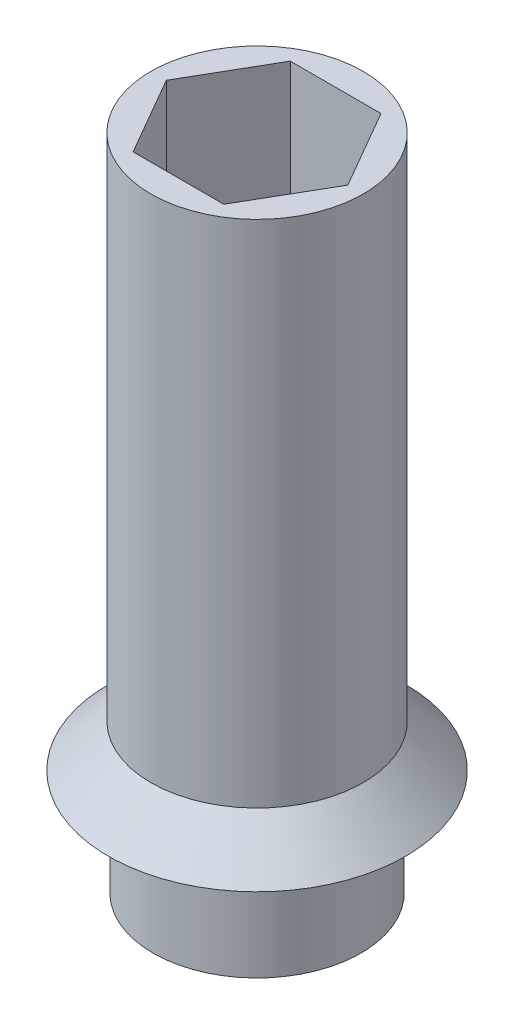
ISO-10303-21;
HEADER;
FILE_DESCRIPTION(('STEP AP214'),'2;1');
FILE_NAME('part.step','',(''),(''),'','','');
FILE_SCHEMA(('AUTOMOTIVE_DESIGN { 1 0 10303 214 1 1 1 1 }'));
ENDSEC;
DATA;
#1=APPLICATION_CONTEXT('core data for automotive mechanical design processes');
#2=APPLICATION_PROTOCOL_DEFINITION('international standard','automotive_design',2000,#1);
#3=PRODUCT_CONTEXT('',#1,'mechanical');
#4=PRODUCT('Part','Part','',(#3));
#5=PRODUCT_RELATED_PRODUCT_CATEGORY('part','',(#4));
#6=PRODUCT_DEFINITION_FORMATION('','',#4);
#7=PRODUCT_DEFINITION_CONTEXT('part definition',#1,'design');
#8=PRODUCT_DEFINITION('design','',#6,#7);
#9=PRODUCT_DEFINITION_SHAPE('','',#8);
#10=(LENGTH_UNIT() NAMED_UNIT(*) SI_UNIT(.MILLI.,.METRE.));
#11=(NAMED_UNIT(*) PLANE_ANGLE_UNIT() SI_UNIT($,.RADIAN.));
#12=(NAMED_UNIT(*) SI_UNIT($,.STERADIAN.) SOLID_ANGLE_UNIT());
#13=UNCERTAINTY_MEASURE_WITH_UNIT(LENGTH_MEASURE(1.E-05),#10,'distance_accuracy_value','');
#14=(GEOMETRIC_REPRESENTATION_CONTEXT(3) GLOBAL_UNCERTAINTY_ASSIGNED_CONTEXT((#13)) GLOBAL_UNIT_ASSIGNED_CONTEXT((#10,
#11,#12)) REPRESENTATION_CONTEXT('',''));
#15=CARTESIAN_POINT('',(0.,0.,0.));
#16=DIRECTION('',(0.,0.,1.));
#17=DIRECTION('',(1.,0.,0.));
#18=AXIS2_PLACEMENT_3D('',#15,#16,#17);
#19=CARTESIAN_POINT('',(0.,31.,0.));
#20=DIRECTION('',(0.,-1.,0.));
#21=DIRECTION('',(0.,0.,-1.));
#22=AXIS2_PLACEMENT_3D('',#19,#20,#21);
#23=CYLINDRICAL_SURFACE('',#22,5.);
#24=CARTESIAN_POINT('',(0.,31.,0.));
#25=DIRECTION('',(0.,1.,0.));
#26=DIRECTION('',(0.,0.,1.));
#27=AXIS2_PLACEMENT_3D('',#24,#25,#26);
#28=CIRCLE('',#27,5.);
#29=CARTESIAN_POINT('',(0.,31.,-5.));
#30=VERTEX_POINT('',#29);
#31=EDGE_CURVE('E124',#30,#30,#28,.T.);
#32=CARTESIAN_POINT('',(0.,7.,0.));
#33=DIRECTION('',(0.,-1.,0.));
#34=DIRECTION('',(0.,0.,-1.));
#35=AXIS2_PLACEMENT_3D('',#32,#33,#34);
#36=CIRCLE('',#35,5.);
#37=CARTESIAN_POINT('',(0.,7.,-5.));
#38=VERTEX_POINT('',#37);
#39=EDGE_CURVE('E11',#38,#38,#36,.T.);
#40=CARTESIAN_POINT('',(0.,31.,-5.));
#41=CARTESIAN_POINT('',(0.,30.75,-5.));
#42=CARTESIAN_POINT('',(0.,30.5,-5.));
#43=CARTESIAN_POINT('',(0.,30.,-5.));
#44=CARTESIAN_POINT('',(0.,29.75,-5.));
#45=CARTESIAN_POINT('',(0.,29.25,-5.));
#46=CARTESIAN_POINT('',(0.,29.,-5.));
#47=CARTESIAN_POINT('',(0.,28.5,-5.));
#48=CARTESIAN_POINT('',(0.,28.25,-5.));
#49=CARTESIAN_POINT('',(0.,27.75,-5.));
#50=CARTESIAN_POINT('',(0.,27.5,-5.));
#51=CARTESIAN_POINT('',(0.,27.,-5.));
#52=CARTESIAN_POINT('',(0.,26.75,-5.));
#53=CARTESIAN_POINT('',(0.,26.25,-5.));
#54=CARTESIAN_POINT('',(0.,26.,-5.));
#55=CARTESIAN_POINT('',(0.,25.5,-5.));
#56=CARTESIAN_POINT('',(0.,25.25,-5.));
#57=CARTESIAN_POINT('',(0.,24.75,-5.));
#58=CARTESIAN_POINT('',(0.,24.5,-5.));
#59=CARTESIAN_POINT('',(0.,24.,-5.));
#60=CARTESIAN_POINT('',(0.,23.75,-5.));
#61=CARTESIAN_POINT('',(0.,23.25,-5.));
#62=CARTESIAN_POINT('',(0.,23.,-5.));
#63=CARTESIAN_POINT('',(0.,22.5,-5.));
#64=CARTESIAN_POINT('',(0.,22.25,-5.));
#65=CARTESIAN_POINT('',(0.,21.75,-5.));
#66=CARTESIAN_POINT('',(0.,21.5,-5.));
#67=CARTESIAN_POINT('',(0.,21.,-5.));
#68=CARTESIAN_POINT('',(0.,20.75,-5.));
#69=CARTESIAN_POINT('',(0.,20.25,-5.));
#70=CARTESIAN_POINT('',(0.,20.,-5.));
#71=CARTESIAN_POINT('',(0.,19.5,-5.));
#72=CARTESIAN_POINT('',(0.,19.25,-5.));
#73=CARTESIAN_POINT('',(0.,18.75,-5.));
#74=CARTESIAN_POINT('',(0.,18.5,-5.));
#75=CARTESIAN_POINT('',(0.,18.,-5.));
#76=CARTESIAN_POINT('',(0.,17.75,-5.));
#77=CARTESIAN_POINT('',(0.,17.25,-5.));
#78=CARTESIAN_POINT('',(0.,17.,-5.));
#79=CARTESIAN_POINT('',(0.,16.5,-5.));
#80=CARTESIAN_POINT('',(0.,16.25,-5.));
#81=CARTESIAN_POINT('',(0.,15.75,-5.));
#82=CARTESIAN_POINT('',(0.,15.5,-5.));
#83=CARTESIAN_POINT('',(0.,15.,-5.));
#84=CARTESIAN_POINT('',(0.,14.75,-5.));
#85=CARTESIAN_POINT('',(0.,14.25,-5.));
#86=CARTESIAN_POINT('',(0.,14.,-5.));
#87=CARTESIAN_POINT('',(0.,13.5,-5.));
#88=CARTESIAN_POINT('',(0.,13.25,-5.));
#89=CARTESIAN_POINT('',(0.,12.75,-5.));
#90=CARTESIAN_POINT('',(0.,12.5,-5.));
#91=CARTESIAN_POINT('',(0.,12.,-5.));
#92=CARTESIAN_POINT('',(0.,11.75,-5.));
#93=CARTESIAN_POINT('',(0.,11.25,-5.));
#94=CARTESIAN_POINT('',(0.,11.,-5.));
#95=CARTESIAN_POINT('',(0.,10.5,-5.));
#96=CARTESIAN_POINT('',(0.,10.25,-5.));
#97=CARTESIAN_POINT('',(0.,9.75,-5.));
#98=CARTESIAN_POINT('',(0.,9.5,-5.));
#99=CARTESIAN_POINT('',(0.,9.,-5.));
#100=CARTESIAN_POINT('',(0.,8.75,-5.));
#101=CARTESIAN_POINT('',(0.,8.25,-5.));
#102=CARTESIAN_POINT('',(0.,8.,-5.));
#103=CARTESIAN_POINT('',(0.,7.5,-5.));
#104=CARTESIAN_POINT('',(0.,7.25,-5.));
#105=CARTESIAN_POINT('',(0.,7.,-5.));
#106=B_SPLINE_CURVE_WITH_KNOTS('',3,(#40,#41,#42,#43,#44,#45,#46,#47,#48,#49,#50,#51,#52,#53,
#54,#55,#56,#57,#58,#59,#60,#61,#62,#63,#64,#65,#66,#67,#68,#69,#70,#71,#72,#73,#74,#75,#76,#77,
#78,#79,#80,#81,#82,#83,#84,#85,#86,#87,#88,#89,#90,#91,#92,#93,#94,#95,#96,#97,#98,#99,#100,
#101,#102,#103,#104,#105),.UNSPECIFIED.,.F.,.F.,(4,2,2,2,2,2,2,2,2,2,2,2,2,2,2,2,2,2,2,2,2,2,2,
2,2,2,2,2,2,2,2,2,4),(0.,0.749999999999997,1.5,2.25,3.,3.75,4.5,5.25,5.99999999999999,6.75,7.5,
8.25,9.,9.74999999999999,10.5,11.25,12.,12.75,13.5,14.25,15.,15.75,16.5,17.25,18.,18.75,19.5,
20.25,21.,21.75,22.5,23.25,24.),.UNSPECIFIED.);
#107=EDGE_CURVE('BSEAM35',#30,#38,#106,.T.);
#108=ORIENTED_EDGE('',*,*,#31,.F.);
#109=ORIENTED_EDGE('',*,*,#39,.F.);
#110=ORIENTED_EDGE('',*,*,#107,.T.);
#111=ORIENTED_EDGE('',*,*,#107,.F.);
#112=EDGE_LOOP('',(#108,#110,#109,#111));
#113=FACE_BOUND('',#112,.T.);
#114=ADVANCED_FACE('F35',(#113),#23,.T.);
#115=CARTESIAN_POINT('',(0.,0.,0.));
#116=DIRECTION('',(0.,1.,0.));
#117=DIRECTION('',(0.,0.,1.));
#118=AXIS2_PLACEMENT_3D('',#115,#116,#117);
#119=PLANE('',#118);
#120=CARTESIAN_POINT('',(0.,0.,0.));
#121=DIRECTION('',(0.,1.,0.));
#122=DIRECTION('',(0.,0.,1.));
#123=AXIS2_PLACEMENT_3D('',#120,#121,#122);
#124=CIRCLE('',#123,4.9);
#125=CARTESIAN_POINT('',(0.,0.,4.9));
#126=VERTEX_POINT('',#125);
#127=EDGE_CURVE('E97',#126,#126,#124,.T.);
#128=ORIENTED_EDGE('',*,*,#127,.F.);
#129=EDGE_LOOP('',(#128));
#130=FACE_BOUND('',#129,.T.);
#131=DIRECTION('',(0.5,0.,-0.866025403784439));
#132=VECTOR('',#131,1.);
#133=CARTESIAN_POINT('',(2.13619599600162,0.,3.7));
#134=LINE('',#133,#132);
#135=CARTESIAN_POINT('',(2.13619599600162,0.,3.7));
#136=VERTEX_POINT('',#135);
#137=CARTESIAN_POINT('',(4.27239199200323,0.,0.));
#138=VERTEX_POINT('',#137);
#139=EDGE_CURVE('E50',#136,#138,#134,.T.);
#140=ORIENTED_EDGE('',*,*,#139,.T.);
#141=DIRECTION('',(-0.5,0.,-0.866025403784439));
#142=VECTOR('',#141,1.);
#143=CARTESIAN_POINT('',(4.27239199200323,0.,0.));
#144=LINE('',#143,#142);
#145=CARTESIAN_POINT('',(2.13619599600161,0.,-3.7));
#146=VERTEX_POINT('',#145);
#147=EDGE_CURVE('E96',#138,#146,#144,.T.);
#148=ORIENTED_EDGE('',*,*,#147,.T.);
#149=DIRECTION('',(-1.,0.,0.));
#150=VECTOR('',#149,1.);
#151=CARTESIAN_POINT('',(2.13619599600161,0.,-3.7));
#152=LINE('',#151,#150);
#153=CARTESIAN_POINT('',(-2.13619599600161,0.,-3.7));
#154=VERTEX_POINT('',#153);
#155=EDGE_CURVE('E129',#146,#154,#152,.T.);
#156=ORIENTED_EDGE('',*,*,#155,.T.);
#157=DIRECTION('',(-0.5,0.,0.866025403784439));
#158=VECTOR('',#157,1.);
#159=CARTESIAN_POINT('',(-2.13619599600161,0.,-3.7));
#160=LINE('',#159,#158);
#161=CARTESIAN_POINT('',(-4.27239199200323,0.,0.));
#162=VERTEX_POINT('',#161);
#163=EDGE_CURVE('E132',#154,#162,#160,.T.);
#164=ORIENTED_EDGE('',*,*,#163,.T.);
#165=DIRECTION('',(0.5,0.,0.866025403784439));
#166=VECTOR('',#165,1.);
#167=CARTESIAN_POINT('',(-4.27239199200323,0.,0.));
#168=LINE('',#167,#166);
#169=CARTESIAN_POINT('',(-2.13619599600161,0.,3.7));
#170=VERTEX_POINT('',#169);
#171=EDGE_CURVE('E135',#162,#170,#168,.T.);
#172=ORIENTED_EDGE('',*,*,#171,.T.);
#173=DIRECTION('',(1.,0.,0.));
#174=VECTOR('',#173,1.);
#175=CARTESIAN_POINT('',(-2.13619599600161,0.,3.7));
#176=LINE('',#175,#174);
#177=EDGE_CURVE('E138',#170,#136,#176,.T.);
#178=ORIENTED_EDGE('',*,*,#177,.T.);
#179=EDGE_LOOP('',(#140,#148,#156,#164,#172,#178));
#180=FACE_BOUND('',#179,.T.);
#181=ADVANCED_FACE('F154',(#130,#180),#119,.F.);
#182=CARTESIAN_POINT('',(0.,5.,0.));
#183=DIRECTION('',(0.,-1.,0.));
#184=DIRECTION('',(0.,0.,-1.));
#185=AXIS2_PLACEMENT_3D('',#182,#183,#184);
#186=CYLINDRICAL_SURFACE('',#185,4.9);
#187=CARTESIAN_POINT('',(0.,5.,0.));
#188=DIRECTION('',(0.,1.,0.));
#189=DIRECTION('',(0.,0.,1.));
#190=AXIS2_PLACEMENT_3D('',#187,#188,#189);
#191=CIRCLE('',#190,4.9);
#192=CARTESIAN_POINT('',(0.,5.,4.9));
#193=VERTEX_POINT('',#192);
#194=EDGE_CURVE('E43',#193,#193,#191,.T.);
#195=ORIENTED_EDGE('',*,*,#194,.F.);
#196=EDGE_LOOP('',(#195));
#197=FACE_BOUND('',#196,.T.);
#198=ORIENTED_EDGE('',*,*,#127,.T.);
#199=EDGE_LOOP('',(#198));
#200=FACE_BOUND('',#199,.T.);
#201=ADVANCED_FACE('F152',(#197,#200),#186,.T.);
#202=CARTESIAN_POINT('',(2.13619599600162,5.,3.7));
#203=DIRECTION('',(-0.866025403784439,0.,-0.5));
#204=DIRECTION('',(-0.5,0.,0.866025403784439));
#205=AXIS2_PLACEMENT_3D('',#202,#203,#204);
#206=PLANE('',#205);
#207=ORIENTED_EDGE('',*,*,#139,.F.);
#208=DIRECTION('',(0.,-1.,0.));
#209=VECTOR('',#208,1.);
#210=CARTESIAN_POINT('',(2.13619599600162,5.,3.7));
#211=LINE('',#210,#209);
#212=CARTESIAN_POINT('',(2.13619599600162,31.,3.7));
#213=VERTEX_POINT('',#212);
#214=EDGE_CURVE('E103',#213,#136,#211,.T.);
#215=ORIENTED_EDGE('',*,*,#214,.F.);
#216=DIRECTION('',(0.5,0.,-0.866025403784439));
#217=VECTOR('',#216,1.);
#218=CARTESIAN_POINT('',(2.13619599600162,31.,3.7));
#219=LINE('',#218,#217);
#220=CARTESIAN_POINT('',(4.27239199200323,31.,0.));
#221=VERTEX_POINT('',#220);
#222=EDGE_CURVE('E101',#213,#221,#219,.T.);
#223=ORIENTED_EDGE('',*,*,#222,.T.);
#224=DIRECTION('',(0.,-1.,0.));
#225=VECTOR('',#224,1.);
#226=CARTESIAN_POINT('',(4.27239199200323,5.,0.));
#227=LINE('',#226,#225);
#228=EDGE_CURVE('E89',#221,#138,#227,.T.);
#229=ORIENTED_EDGE('',*,*,#228,.T.);
#230=EDGE_LOOP('',(#207,#215,#223,#229));
#231=FACE_BOUND('',#230,.T.);
#232=ADVANCED_FACE('F102',(#231),#206,.T.);
#233=CARTESIAN_POINT('',(4.27239199200323,5.,0.));
#234=DIRECTION('',(-0.866025403784438,0.,0.5));
#235=DIRECTION('',(0.5,0.,0.866025403784438));
#236=AXIS2_PLACEMENT_3D('',#233,#234,#235);
#237=PLANE('',#236);
#238=ORIENTED_EDGE('',*,*,#147,.F.);
#239=ORIENTED_EDGE('',*,*,#228,.F.);
#240=DIRECTION('',(-0.5,0.,-0.866025403784439));
#241=VECTOR('',#240,1.);
#242=CARTESIAN_POINT('',(4.27239199200323,31.,0.));
#243=LINE('',#242,#241);
#244=CARTESIAN_POINT('',(2.13619599600162,31.,-3.7));
#245=VERTEX_POINT('',#244);
#246=EDGE_CURVE('E93',#221,#245,#243,.T.);
#247=ORIENTED_EDGE('',*,*,#246,.T.);
#248=DIRECTION('',(0.,-1.,0.));
#249=VECTOR('',#248,1.);
#250=CARTESIAN_POINT('',(2.13619599600161,5.,-3.7));
#251=LINE('',#250,#249);
#252=EDGE_CURVE('E98',#245,#146,#251,.T.);
#253=ORIENTED_EDGE('',*,*,#252,.T.);
#254=EDGE_LOOP('',(#238,#239,#247,#253));
#255=FACE_BOUND('',#254,.T.);
#256=ADVANCED_FACE('F91',(#255),#237,.T.);
#257=CARTESIAN_POINT('',(2.13619599600161,5.,-3.7));
#258=DIRECTION('',(0.,0.,1.));
#259=DIRECTION('',(1.,0.,0.));
#260=AXIS2_PLACEMENT_3D('',#257,#258,#259);
#261=PLANE('',#260);
#262=ORIENTED_EDGE('',*,*,#155,.F.);
#263=ORIENTED_EDGE('',*,*,#252,.F.);
#264=DIRECTION('',(-1.,0.,0.));
#265=VECTOR('',#264,1.);
#266=CARTESIAN_POINT('',(2.13619599600162,31.,-3.7));
#267=LINE('',#266,#265);
#268=CARTESIAN_POINT('',(-2.13619599600162,31.,-3.7));
#269=VERTEX_POINT('',#268);
#270=EDGE_CURVE('E112',#245,#269,#267,.T.);
#271=ORIENTED_EDGE('',*,*,#270,.T.);
#272=DIRECTION('',(0.,-1.,0.));
#273=VECTOR('',#272,1.);
#274=CARTESIAN_POINT('',(-2.13619599600161,5.,-3.7));
#275=LINE('',#274,#273);
#276=EDGE_CURVE('E145',#269,#154,#275,.T.);
#277=ORIENTED_EDGE('',*,*,#276,.T.);
#278=EDGE_LOOP('',(#262,#263,#271,#277));
#279=FACE_BOUND('',#278,.T.);
#280=ADVANCED_FACE('F167',(#279),#261,.T.);
#281=CARTESIAN_POINT('',(-2.13619599600161,5.,-3.7));
#282=DIRECTION('',(0.866025403784439,0.,0.5));
#283=DIRECTION('',(0.5,0.,-0.866025403784439));
#284=AXIS2_PLACEMENT_3D('',#281,#282,#283);
#285=PLANE('',#284);
#286=ORIENTED_EDGE('',*,*,#163,.F.);
#287=ORIENTED_EDGE('',*,*,#276,.F.);
#288=DIRECTION('',(-0.5,0.,0.866025403784439));
#289=VECTOR('',#288,1.);
#290=CARTESIAN_POINT('',(-2.13619599600162,31.,-3.7));
#291=LINE('',#290,#289);
#292=CARTESIAN_POINT('',(-4.27239199200323,31.,0.));
#293=VERTEX_POINT('',#292);
#294=EDGE_CURVE('E114',#269,#293,#291,.T.);
#295=ORIENTED_EDGE('',*,*,#294,.T.);
#296=DIRECTION('',(0.,-1.,0.));
#297=VECTOR('',#296,1.);
#298=CARTESIAN_POINT('',(-4.27239199200323,5.,0.));
#299=LINE('',#298,#297);
#300=EDGE_CURVE('E143',#293,#162,#299,.T.);
#301=ORIENTED_EDGE('',*,*,#300,.T.);
#302=EDGE_LOOP('',(#286,#287,#295,#301));
#303=FACE_BOUND('',#302,.T.);
#304=ADVANCED_FACE('F164',(#303),#285,.T.);
#305=CARTESIAN_POINT('',(-4.27239199200323,5.,0.));
#306=DIRECTION('',(0.866025403784439,0.,-0.5));
#307=DIRECTION('',(-0.5,0.,-0.866025403784439));
#308=AXIS2_PLACEMENT_3D('',#305,#306,#307);
#309=PLANE('',#308);
#310=ORIENTED_EDGE('',*,*,#171,.F.);
#311=ORIENTED_EDGE('',*,*,#300,.F.);
#312=DIRECTION('',(0.5,0.,0.866025403784439));
#313=VECTOR('',#312,1.);
#314=CARTESIAN_POINT('',(-4.27239199200323,31.,0.));
#315=LINE('',#314,#313);
#316=CARTESIAN_POINT('',(-2.13619599600162,31.,3.7));
#317=VERTEX_POINT('',#316);
#318=EDGE_CURVE('E120',#293,#317,#315,.T.);
#319=ORIENTED_EDGE('',*,*,#318,.T.);
#320=DIRECTION('',(0.,-1.,0.));
#321=VECTOR('',#320,1.);
#322=CARTESIAN_POINT('',(-2.13619599600161,5.,3.7));
#323=LINE('',#322,#321);
#324=EDGE_CURVE('E58',#317,#170,#323,.T.);
#325=ORIENTED_EDGE('',*,*,#324,.T.);
#326=EDGE_LOOP('',(#310,#311,#319,#325));
#327=FACE_BOUND('',#326,.T.);
#328=ADVANCED_FACE('F161',(#327),#309,.T.);
#329=CARTESIAN_POINT('',(-2.13619599600161,5.,3.7));
#330=DIRECTION('',(0.,0.,-1.));
#331=DIRECTION('',(-1.,0.,0.));
#332=AXIS2_PLACEMENT_3D('',#329,#330,#331);
#333=PLANE('',#332);
#334=ORIENTED_EDGE('',*,*,#177,.F.);
#335=ORIENTED_EDGE('',*,*,#324,.F.);
#336=DIRECTION('',(1.,0.,0.));
#337=VECTOR('',#336,1.);
#338=CARTESIAN_POINT('',(-2.13619599600162,31.,3.7));
#339=LINE('',#338,#337);
#340=EDGE_CURVE('E122',#317,#213,#339,.T.);
#341=ORIENTED_EDGE('',*,*,#340,.T.);
#342=ORIENTED_EDGE('',*,*,#214,.T.);
#343=EDGE_LOOP('',(#334,#335,#341,#342));
#344=FACE_BOUND('',#343,.T.);
#345=ADVANCED_FACE('F159',(#344),#333,.T.);
#346=CARTESIAN_POINT('',(0.,31.,0.));
#347=DIRECTION('',(0.,1.,0.));
#348=DIRECTION('',(0.,0.,1.));
#349=AXIS2_PLACEMENT_3D('',#346,#347,#348);
#350=PLANE('',#349);
#351=ORIENTED_EDGE('',*,*,#31,.T.);
#352=EDGE_LOOP('',(#351));
#353=FACE_BOUND('',#352,.T.);
#354=ORIENTED_EDGE('',*,*,#246,.F.);
#355=ORIENTED_EDGE('',*,*,#222,.F.);
#356=ORIENTED_EDGE('',*,*,#340,.F.);
#357=ORIENTED_EDGE('',*,*,#318,.F.);
#358=ORIENTED_EDGE('',*,*,#294,.F.);
#359=ORIENTED_EDGE('',*,*,#270,.F.);
#360=EDGE_LOOP('',(#354,#355,#356,#357,#358,#359));
#361=FACE_BOUND('',#360,.T.);
#362=ADVANCED_FACE('F109',(#353,#361),#350,.T.);
#363=CARTESIAN_POINT('',(0.,5.,0.));
#364=DIRECTION('',(0.,1.,0.));
#365=DIRECTION('',(0.,0.,1.));
#366=AXIS2_PLACEMENT_3D('',#363,#364,#365);
#367=PLANE('',#366);
#368=ORIENTED_EDGE('',*,*,#194,.T.);
#369=EDGE_LOOP('',(#368));
#370=FACE_BOUND('',#369,.T.);
#371=CARTESIAN_POINT('',(0.,5.,0.));
#372=DIRECTION('',(0.,-1.,0.));
#373=DIRECTION('',(0.,0.,-1.));
#374=AXIS2_PLACEMENT_3D('',#371,#372,#373);
#375=CIRCLE('',#374,7.);
#376=CARTESIAN_POINT('',(0.,5.,-7.));
#377=VERTEX_POINT('',#376);
#378=EDGE_CURVE('E107',#377,#377,#375,.T.);
#379=ORIENTED_EDGE('',*,*,#378,.T.);
#380=EDGE_LOOP('',(#379));
#381=FACE_BOUND('',#380,.T.);
#382=ADVANCED_FACE('F185',(#370,#381),#367,.F.);
#383=CARTESIAN_POINT('',(0.,5.,0.));
#384=DIRECTION('',(0.,-1.,0.));
#385=DIRECTION('',(0.,0.,-1.));
#386=AXIS2_PLACEMENT_3D('',#383,#384,#385);
#387=CONICAL_SURFACE('',#386,7.,0.78539816339745);
#388=ORIENTED_EDGE('',*,*,#39,.T.);
#389=EDGE_LOOP('',(#388));
#390=FACE_BOUND('',#389,.T.);
#391=ORIENTED_EDGE('',*,*,#378,.F.);
#392=EDGE_LOOP('',(#391));
#393=FACE_BOUND('',#392,.T.);
#394=ADVANCED_FACE('F37',(#390,#393),#387,.T.);
#395=CLOSED_SHELL('',(#114,#181,#201,#232,#256,#280,#304,#328,#345,#362,#382,#394));
#396=MANIFOLD_SOLID_BREP('B2',#395);
#397=ADVANCED_BREP_SHAPE_REPRESENTATION('',(#18,#396),#14);
#398=SHAPE_DEFINITION_REPRESENTATION(#9,#397);
ENDSEC;
END-ISO-10303-21;
